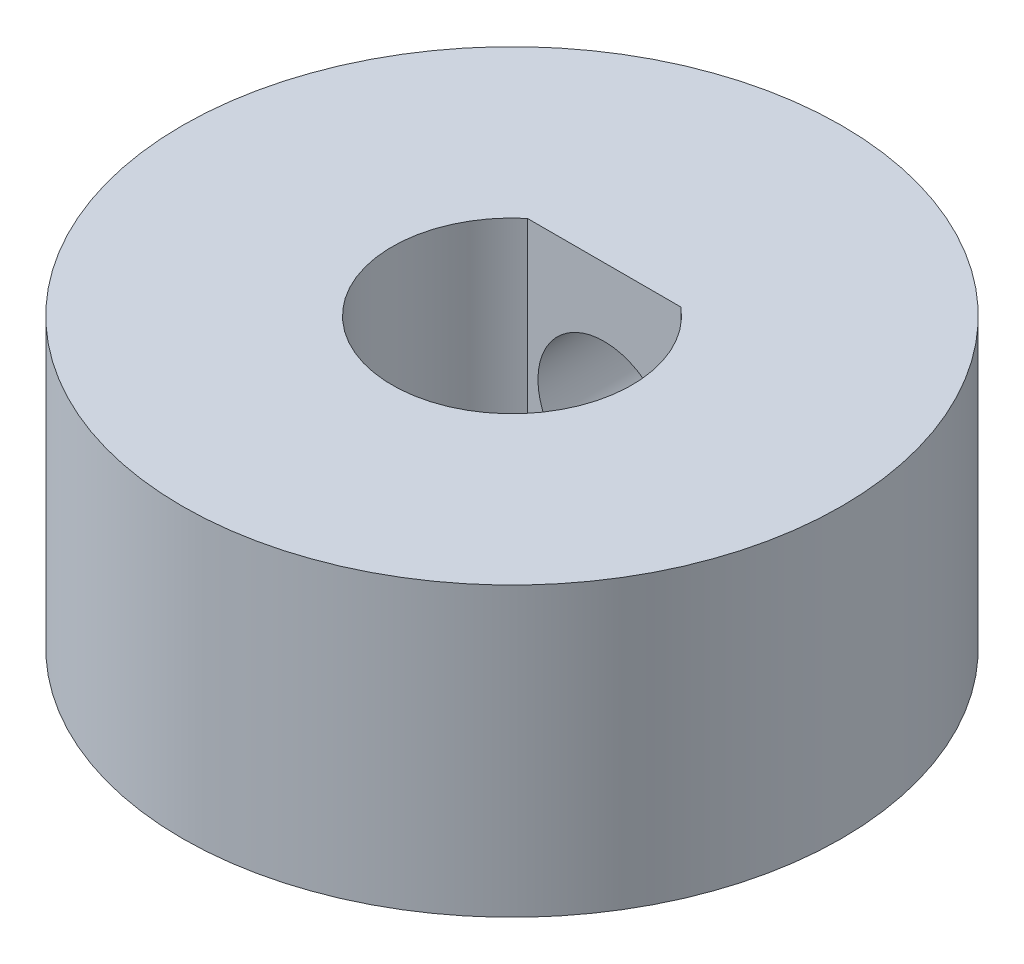
ISO-10303-21;
HEADER;
FILE_DESCRIPTION(('STEP AP214'),'2;1');
FILE_NAME('part.step','',(''),(''),'','','');
FILE_SCHEMA(('AUTOMOTIVE_DESIGN { 1 0 10303 214 1 1 1 1 }'));
ENDSEC;
DATA;
#1=APPLICATION_CONTEXT('core data for automotive mechanical design processes');
#2=APPLICATION_PROTOCOL_DEFINITION('international standard','automotive_design',2000,#1);
#3=PRODUCT_CONTEXT('',#1,'mechanical');
#4=PRODUCT('Part','Part','',(#3));
#5=PRODUCT_RELATED_PRODUCT_CATEGORY('part','',(#4));
#6=PRODUCT_DEFINITION_FORMATION('','',#4);
#7=PRODUCT_DEFINITION_CONTEXT('part definition',#1,'design');
#8=PRODUCT_DEFINITION('design','',#6,#7);
#9=PRODUCT_DEFINITION_SHAPE('','',#8);
#10=(LENGTH_UNIT() NAMED_UNIT(*) SI_UNIT(.MILLI.,.METRE.));
#11=(NAMED_UNIT(*) PLANE_ANGLE_UNIT() SI_UNIT($,.RADIAN.));
#12=(NAMED_UNIT(*) SI_UNIT($,.STERADIAN.) SOLID_ANGLE_UNIT());
#13=UNCERTAINTY_MEASURE_WITH_UNIT(LENGTH_MEASURE(1.E-05),#10,'distance_accuracy_value','');
#14=(GEOMETRIC_REPRESENTATION_CONTEXT(3) GLOBAL_UNCERTAINTY_ASSIGNED_CONTEXT((#13)) GLOBAL_UNIT_ASSIGNED_CONTEXT((#10,
#11,#12)) REPRESENTATION_CONTEXT('',''));
#15=CARTESIAN_POINT('',(0.,0.,0.));
#16=DIRECTION('',(0.,0.,1.));
#17=DIRECTION('',(1.,0.,0.));
#18=AXIS2_PLACEMENT_3D('',#15,#16,#17);
#19=CARTESIAN_POINT('',(0.,7.62,0.));
#20=DIRECTION('',(0.,-1.,0.));
#21=DIRECTION('',(0.,0.,-1.));
#22=AXIS2_PLACEMENT_3D('',#19,#20,#21);
#23=CYLINDRICAL_SURFACE('',#22,3.175);
#24=CARTESIAN_POINT('',(0.,0.,0.));
#25=DIRECTION('',(0.,1.,0.));
#26=DIRECTION('',(0.,0.,1.));
#27=AXIS2_PLACEMENT_3D('',#24,#25,#26);
#28=CIRCLE('',#27,3.175);
#29=CARTESIAN_POINT('',(-2.032,0.,-2.43959033446192));
#30=VERTEX_POINT('',#29);
#31=CARTESIAN_POINT('',(2.032,0.,-2.43959033446192));
#32=VERTEX_POINT('',#31);
#33=EDGE_CURVE('E77',#30,#32,#28,.T.);
#34=ORIENTED_EDGE('',*,*,#33,.F.);
#35=DIRECTION('',(0.,-1.,0.));
#36=VECTOR('',#35,1.);
#37=CARTESIAN_POINT('',(-2.032,7.62,-2.43959033446192));
#38=LINE('',#37,#36);
#39=CARTESIAN_POINT('',(-2.032,7.62,-2.43959033446192));
#40=VERTEX_POINT('',#39);
#41=EDGE_CURVE('E55',#40,#30,#38,.T.);
#42=ORIENTED_EDGE('',*,*,#41,.F.);
#43=CARTESIAN_POINT('',(0.,7.62,0.));
#44=DIRECTION('',(0.,1.,0.));
#45=DIRECTION('',(0.,0.,1.));
#46=AXIS2_PLACEMENT_3D('',#43,#44,#45);
#47=CIRCLE('',#46,3.175);
#48=CARTESIAN_POINT('',(2.032,7.62,-2.43959033446192));
#49=VERTEX_POINT('',#48);
#50=EDGE_CURVE('E78',#40,#49,#47,.T.);
#51=ORIENTED_EDGE('',*,*,#50,.T.);
#52=DIRECTION('',(0.,-1.,0.));
#53=VECTOR('',#52,1.);
#54=CARTESIAN_POINT('',(2.032,7.62,-2.43959033446192));
#55=LINE('',#54,#53);
#56=EDGE_CURVE('E75',#49,#32,#55,.T.);
#57=ORIENTED_EDGE('',*,*,#56,.T.);
#58=EDGE_LOOP('',(#34,#42,#51,#57));
#59=FACE_BOUND('',#58,.T.);
#60=ADVANCED_FACE('F41',(#59),#23,.F.);
#61=CARTESIAN_POINT('',(0.,7.62,-2.43959033446192));
#62=DIRECTION('',(0.,0.,-1.));
#63=DIRECTION('',(-1.,0.,0.));
#64=AXIS2_PLACEMENT_3D('',#61,#62,#63);
#65=PLANE('',#64);
#66=CARTESIAN_POINT('',(0.,4.064,-2.43959033446191));
#67=DIRECTION('',(0.,0.,-1.));
#68=DIRECTION('',(-1.,0.,0.));
#69=AXIS2_PLACEMENT_3D('',#66,#67,#68);
#70=CIRCLE('',#69,1.7526);
#71=CARTESIAN_POINT('',(-1.7526,4.064,-2.43959033446191));
#72=VERTEX_POINT('',#71);
#73=EDGE_CURVE('E95',#72,#72,#70,.F.);
#74=ORIENTED_EDGE('',*,*,#73,.F.);
#75=EDGE_LOOP('',(#74));
#76=FACE_BOUND('',#75,.T.);
#77=DIRECTION('',(1.,0.,0.));
#78=VECTOR('',#77,1.);
#79=CARTESIAN_POINT('',(0.,0.,-2.43959033446192));
#80=LINE('',#79,#78);
#81=EDGE_CURVE('E82',#30,#32,#80,.T.);
#82=ORIENTED_EDGE('',*,*,#81,.T.);
#83=ORIENTED_EDGE('',*,*,#56,.F.);
#84=DIRECTION('',(1.,0.,0.));
#85=VECTOR('',#84,1.);
#86=CARTESIAN_POINT('',(0.,7.62,-2.43959033446192));
#87=LINE('',#86,#85);
#88=EDGE_CURVE('E62',#40,#49,#87,.T.);
#89=ORIENTED_EDGE('',*,*,#88,.F.);
#90=ORIENTED_EDGE('',*,*,#41,.T.);
#91=EDGE_LOOP('',(#82,#83,#89,#90));
#92=FACE_BOUND('',#91,.T.);
#93=ADVANCED_FACE('F83',(#76,#92),#65,.F.);
#94=CARTESIAN_POINT('',(0.,7.62,0.));
#95=DIRECTION('',(0.,-1.,0.));
#96=DIRECTION('',(0.,0.,-1.));
#97=AXIS2_PLACEMENT_3D('',#94,#95,#96);
#98=CYLINDRICAL_SURFACE('',#97,8.73125);
#99=CARTESIAN_POINT('',(0.,6.8326,-8.73125));
#100=CARTESIAN_POINT('',(-0.151472384584233,6.83259935298434,-8.73124947449106));
#101=CARTESIAN_POINT('',(-0.3029520113905,6.82012837544081,-8.72727129269476));
#102=CARTESIAN_POINT('',(-0.601474430383907,6.77070940866285,-8.71179172891819));
#103=CARTESIAN_POINT('',(-0.748516330870155,6.73375653391253,-8.70028884534234));
#104=CARTESIAN_POINT('',(-1.0338156844574,6.63675016258388,-8.67101504432199));
#105=CARTESIAN_POINT('',(-1.17208657407177,6.576733045639,-8.65325400163016));
#106=CARTESIAN_POINT('',(-1.4366017145973,6.43545872542401,-8.61329318281153));
#107=CARTESIAN_POINT('',(-1.56284395859653,6.35419798621246,-8.59109266789175));
#108=CARTESIAN_POINT('',(-1.80372047067413,6.17003289918125,-8.54381798243644));
#109=CARTESIAN_POINT('',(-1.91792010208838,6.06657656530013,-8.51867983669334));
#110=CARTESIAN_POINT('',(-2.12767343767985,5.84213193357004,-8.46872959414002));
#111=CARTESIAN_POINT('',(-2.2232235392977,5.72114025624111,-8.44391756118718));
#112=CARTESIAN_POINT('',(-2.39534876748479,5.46126454367839,-8.39673867205372));
#113=CARTESIAN_POINT('',(-2.47137620234697,5.32200209421514,-8.37445056621347));
#114=CARTESIAN_POINT('',(-2.59874998873783,5.03184701475919,-8.33580756098609));
#115=CARTESIAN_POINT('',(-2.65010306105726,4.88095756473137,-8.31945104625312));
#116=CARTESIAN_POINT('',(-2.72507133844266,4.57674478071945,-8.29519330661295));
#117=CARTESIAN_POINT('',(-2.74949460363218,4.42364072089239,-8.28704643290134));
#118=CARTESIAN_POINT('',(-2.77243486132888,4.11530797622602,-8.27940162413595));
#119=CARTESIAN_POINT('',(-2.77095897618445,3.96007988723457,-8.27990131125003));
#120=CARTESIAN_POINT('',(-2.74277384122496,3.65863343886841,-8.28927666852696));
#121=CARTESIAN_POINT('',(-2.71709756240168,3.51230602485856,-8.2978094371684));
#122=CARTESIAN_POINT('',(-2.64291753019867,3.22615374592841,-8.32173160663915));
#123=CARTESIAN_POINT('',(-2.59441128518325,3.08632959259704,-8.33712175586515));
#124=CARTESIAN_POINT('',(-2.47523037707125,2.81471682139735,-8.37328338181039));
#125=CARTESIAN_POINT('',(-2.40423533028052,2.68307947211083,-8.39413182382158));
#126=CARTESIAN_POINT('',(-2.24231457480099,2.43325025607457,-8.43882633045629));
#127=CARTESIAN_POINT('',(-2.15138356095298,2.3150619809983,-8.46267319226737));
#128=CARTESIAN_POINT('',(-1.94712641847256,2.08965345989879,-8.51204751992886));
#129=CARTESIAN_POINT('',(-1.83294927818404,1.98320868631123,-8.53760132442253));
#130=CARTESIAN_POINT('',(-1.5880475571794,1.79078574495724,-8.58652454816324));
#131=CARTESIAN_POINT('',(-1.4573216781893,1.70480918447965,-8.60989379577812));
#132=CARTESIAN_POINT('',(-1.1815066053666,1.5552168410868,-8.6520728477574));
#133=CARTESIAN_POINT('',(-1.03630805468641,1.49179091316723,-8.67084354454731));
#134=CARTESIAN_POINT('',(-0.736567856371046,1.39049704215195,-8.7014279616364));
#135=CARTESIAN_POINT('',(-0.582029149746095,1.35262109914003,-8.71324385939411));
#136=CARTESIAN_POINT('',(-0.274574060893411,1.30483468402359,-8.72823473184806));
#137=CARTESIAN_POINT('',(-0.121836344071211,1.29387484025335,-8.73173376976));
#138=CARTESIAN_POINT('',(0.183314914836963,1.29726646301027,-8.73065800910595));
#139=CARTESIAN_POINT('',(0.335728502364473,1.31161411017102,-8.72608442884663));
#140=CARTESIAN_POINT('',(0.631824679178514,1.36437346823906,-8.70959051257118));
#141=CARTESIAN_POINT('',(0.775631013443132,1.40215653444254,-8.69786222963305));
#142=CARTESIAN_POINT('',(1.05481947051424,1.49994307731108,-8.66843724040155));
#143=CARTESIAN_POINT('',(1.19020054164173,1.55994932150041,-8.65073979077305));
#144=CARTESIAN_POINT('',(1.4524347312682,1.7021410842905,-8.61064475376114));
#145=CARTESIAN_POINT('',(1.57899276968752,1.78484014831072,-8.588141406858));
#146=CARTESIAN_POINT('',(1.81678475390539,1.9694567459568,-8.54100338427114));
#147=CARTESIAN_POINT('',(1.9280144126383,2.07137963733053,-8.51636811545168));
#148=CARTESIAN_POINT('',(2.1367142462555,2.29648711494163,-8.4664734297526));
#149=CARTESIAN_POINT('',(2.23343617915372,2.42037047486329,-8.44122965963221));
#150=CARTESIAN_POINT('',(2.4047910332809,2.68315731234719,-8.39402366718418));
#151=CARTESIAN_POINT('',(2.47942420498251,2.82206061956828,-8.37206140764768));
#152=CARTESIAN_POINT('',(2.60404062267292,3.11072422716668,-8.33414377062547));
#153=CARTESIAN_POINT('',(2.65411076479825,3.26044407288566,-8.31816726556818));
#154=CARTESIAN_POINT('',(2.72814027283026,3.56680321246625,-8.29418596912205));
#155=CARTESIAN_POINT('',(2.75210995727697,3.72343974638568,-8.28617802755383));
#156=CARTESIAN_POINT('',(2.77250292470933,4.03134505258087,-8.27937538147864));
#157=CARTESIAN_POINT('',(2.77015671446854,4.18252421917552,-8.28016909910884));
#158=CARTESIAN_POINT('',(2.74096747215079,4.48221970476836,-8.2898766597354));
#159=CARTESIAN_POINT('',(2.71412564708891,4.63073615460356,-8.29879010263436));
#160=CARTESIAN_POINT('',(2.63754140234477,4.91861837349535,-8.32344101159602));
#161=CARTESIAN_POINT('',(2.58816103947087,5.05809042121644,-8.33907036972361));
#162=CARTESIAN_POINT('',(2.46818810716033,5.32688036990157,-8.37536170452968));
#163=CARTESIAN_POINT('',(2.39759113260101,5.45619615512055,-8.39602472615923));
#164=CARTESIAN_POINT('',(2.23387835420621,5.70661995387902,-8.44108922352175));
#165=CARTESIAN_POINT('',(2.13997279679889,5.82719059799191,-8.46560741814809));
#166=CARTESIAN_POINT('',(1.93368630683579,6.05126075511337,-8.51509362004053));
#167=CARTESIAN_POINT('',(1.82130037389265,6.15475563256535,-8.54006174741605));
#168=CARTESIAN_POINT('',(1.57665069072115,6.34526205813802,-8.58865246257704));
#169=CARTESIAN_POINT('',(1.44384128482807,6.43159405567302,-8.61220050648618));
#170=CARTESIAN_POINT('',(1.16484980429616,6.58059622072828,-8.65434625576332));
#171=CARTESIAN_POINT('',(1.018672625294,6.64327500791705,-8.67294576373933));
#172=CARTESIAN_POINT('',(0.72856186729587,6.73904703416671,-8.7019271673855));
#173=CARTESIAN_POINT('',(0.585301340574924,6.77402598526938,-8.71282596740998));
#174=CARTESIAN_POINT('',(0.294695565068272,6.82080026865578,-8.72748686535895));
#175=CARTESIAN_POINT('',(0.147351209283364,6.83260062941202,-8.73125051121119));
#176=CARTESIAN_POINT('',(0.,6.8326,-8.73125));
#177=B_SPLINE_CURVE_WITH_KNOTS('',3,(#99,#100,#101,#102,#103,#104,#105,#106,#107,#108,#109,#110,
#111,#112,#113,#114,#115,#116,#117,#118,#119,#120,#121,#122,#123,#124,#125,#126,#127,#128,#129,
#130,#131,#132,#133,#134,#135,#136,#137,#138,#139,#140,#141,#142,#143,#144,#145,#146,#147,#148,
#149,#150,#151,#152,#153,#154,#155,#156,#157,#158,#159,#160,#161,#162,#163,#164,#165,#166,#167,
#168,#169,#170,#171,#172,#173,#174,#175,#176),.UNSPECIFIED.,.T.,.F.,(4,2,2,2,2,2,2,2,2,2,2,2,2,
2,2,2,2,2,2,2,2,2,2,2,2,2,2,2,2,2,2,2,2,2,2,2,2,2,4),(0.,0.453875402871957,0.907841406715232,
1.36109428167842,1.81442264740051,2.28070145331589,2.74707024209938,3.22536463900073,
3.70352868435285,4.16691760762408,4.63017909947097,5.07452138042134,5.51891216761527,
5.96994245980804,6.42109292164611,6.8934249132351,7.3657939829856,7.84205069695993,
8.31815822163036,8.77538643564025,9.23254565139696,9.67794257103017,10.1233949760448,
10.5799040113177,11.0365404657625,11.5118416234337,11.9871373912826,12.4607393666331,
12.9341540403948,13.3855282360861,13.8368801916315,14.2812238524466,14.7256598344222,
15.1879247961639,15.6503150431813,16.1284162822251,16.6063431236748,17.0479655585333,
17.4894921751553),.UNSPECIFIED.);
#178=CARTESIAN_POINT('',(0.,6.8326,-8.73125));
#179=VERTEX_POINT('',#178);
#180=EDGE_CURVE('E11',#179,#179,#177,.T.);
#181=ORIENTED_EDGE('',*,*,#180,.T.);
#182=EDGE_LOOP('',(#181));
#183=FACE_BOUND('',#182,.T.);
#184=CARTESIAN_POINT('',(0.,7.62,0.));
#185=DIRECTION('',(0.,1.,0.));
#186=DIRECTION('',(0.,0.,1.));
#187=AXIS2_PLACEMENT_3D('',#184,#185,#186);
#188=CIRCLE('',#187,8.73125);
#189=CARTESIAN_POINT('',(0.,7.62,8.73125));
#190=VERTEX_POINT('',#189);
#191=EDGE_CURVE('E80',#190,#190,#188,.T.);
#192=ORIENTED_EDGE('',*,*,#191,.F.);
#193=EDGE_LOOP('',(#192));
#194=FACE_BOUND('',#193,.T.);
#195=CARTESIAN_POINT('',(0.,0.,0.));
#196=DIRECTION('',(0.,1.,0.));
#197=DIRECTION('',(0.,0.,1.));
#198=AXIS2_PLACEMENT_3D('',#195,#196,#197);
#199=CIRCLE('',#198,8.73125);
#200=CARTESIAN_POINT('',(0.,0.,8.73125));
#201=VERTEX_POINT('',#200);
#202=EDGE_CURVE('E86',#201,#201,#199,.T.);
#203=ORIENTED_EDGE('',*,*,#202,.T.);
#204=EDGE_LOOP('',(#203));
#205=FACE_BOUND('',#204,.T.);
#206=ADVANCED_FACE('F120',(#183,#194,#205),#98,.T.);
#207=CARTESIAN_POINT('',(0.,7.62,0.));
#208=DIRECTION('',(0.,1.,0.));
#209=DIRECTION('',(0.,0.,1.));
#210=AXIS2_PLACEMENT_3D('',#207,#208,#209);
#211=PLANE('',#210);
#212=ORIENTED_EDGE('',*,*,#50,.F.);
#213=ORIENTED_EDGE('',*,*,#88,.T.);
#214=EDGE_LOOP('',(#212,#213));
#215=FACE_BOUND('',#214,.T.);
#216=ORIENTED_EDGE('',*,*,#191,.T.);
#217=EDGE_LOOP('',(#216));
#218=FACE_BOUND('',#217,.T.);
#219=ADVANCED_FACE('F125',(#215,#218),#211,.T.);
#220=CARTESIAN_POINT('',(0.,0.,0.));
#221=DIRECTION('',(0.,1.,0.));
#222=DIRECTION('',(0.,0.,1.));
#223=AXIS2_PLACEMENT_3D('',#220,#221,#222);
#224=PLANE('',#223);
#225=ORIENTED_EDGE('',*,*,#33,.T.);
#226=ORIENTED_EDGE('',*,*,#81,.F.);
#227=EDGE_LOOP('',(#225,#226));
#228=FACE_BOUND('',#227,.T.);
#229=ORIENTED_EDGE('',*,*,#202,.F.);
#230=EDGE_LOOP('',(#229));
#231=FACE_BOUND('',#230,.T.);
#232=ADVANCED_FACE('F88',(#228,#231),#224,.F.);
#233=CARTESIAN_POINT('',(0.,4.064,-4.92125));
#234=DIRECTION('',(0.,0.,-1.));
#235=DIRECTION('',(-1.,0.,0.));
#236=AXIS2_PLACEMENT_3D('',#233,#234,#235);
#237=CYLINDRICAL_SURFACE('',#236,2.7686);
#238=CARTESIAN_POINT('',(0.,4.064,-4.92125));
#239=DIRECTION('',(0.,0.,-1.));
#240=DIRECTION('',(-1.,0.,0.));
#241=AXIS2_PLACEMENT_3D('',#238,#239,#240);
#242=CIRCLE('',#241,2.7686);
#243=CARTESIAN_POINT('',(-2.7686,4.064,-4.92125));
#244=VERTEX_POINT('',#243);
#245=EDGE_CURVE('E91',#244,#244,#242,.T.);
#246=ORIENTED_EDGE('',*,*,#245,.F.);
#247=EDGE_LOOP('',(#246));
#248=FACE_BOUND('',#247,.T.);
#249=ORIENTED_EDGE('',*,*,#180,.F.);
#250=EDGE_LOOP('',(#249));
#251=FACE_BOUND('',#250,.T.);
#252=ADVANCED_FACE('F131',(#248,#251),#237,.F.);
#253=CARTESIAN_POINT('',(0.,4.064,-4.92125));
#254=DIRECTION('',(0.,0.,-1.));
#255=DIRECTION('',(-1.,0.,0.));
#256=AXIS2_PLACEMENT_3D('',#253,#254,#255);
#257=PLANE('',#256);
#258=CARTESIAN_POINT('',(0.,4.064,-4.92125));
#259=DIRECTION('',(0.,0.,-1.));
#260=DIRECTION('',(-1.,0.,0.));
#261=AXIS2_PLACEMENT_3D('',#258,#259,#260);
#262=CIRCLE('',#261,1.7526);
#263=CARTESIAN_POINT('',(-1.7526,4.064,-4.92125));
#264=VERTEX_POINT('',#263);
#265=EDGE_CURVE('E109',#264,#264,#262,.T.);
#266=ORIENTED_EDGE('',*,*,#265,.F.);
#267=EDGE_LOOP('',(#266));
#268=FACE_BOUND('',#267,.T.);
#269=ORIENTED_EDGE('',*,*,#245,.T.);
#270=EDGE_LOOP('',(#269));
#271=FACE_BOUND('',#270,.T.);
#272=ADVANCED_FACE('F136',(#268,#271),#257,.T.);
#273=CARTESIAN_POINT('',(0.,4.064,8.73225));
#274=DIRECTION('',(0.,0.,-1.));
#275=DIRECTION('',(-1.,0.,0.));
#276=AXIS2_PLACEMENT_3D('',#273,#274,#275);
#277=CYLINDRICAL_SURFACE('',#276,1.7526);
#278=ORIENTED_EDGE('',*,*,#265,.T.);
#279=EDGE_LOOP('',(#278));
#280=FACE_BOUND('',#279,.T.);
#281=ORIENTED_EDGE('',*,*,#73,.T.);
#282=EDGE_LOOP('',(#281));
#283=FACE_BOUND('',#282,.T.);
#284=ADVANCED_FACE('F117',(#280,#283),#277,.F.);
#285=CLOSED_SHELL('',(#60,#93,#206,#219,#232,#252,#272,#284));
#286=MANIFOLD_SOLID_BREP('B2',#285);
#287=ADVANCED_BREP_SHAPE_REPRESENTATION('',(#18,#286),#14);
#288=SHAPE_DEFINITION_REPRESENTATION(#9,#287);
ENDSEC;
END-ISO-10303-21;
